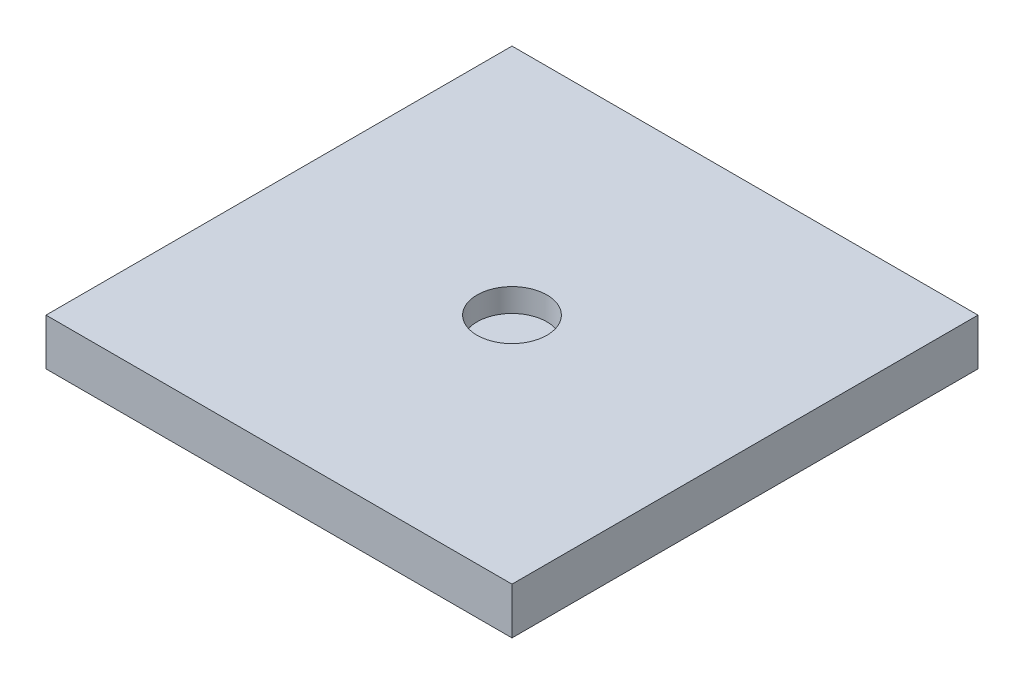
ISO-10303-21;
HEADER;
FILE_DESCRIPTION(('STEP AP214'),'2;1');
FILE_NAME('part.step','',(''),(''),'','','');
FILE_SCHEMA(('AUTOMOTIVE_DESIGN { 1 0 10303 214 1 1 1 1 }'));
ENDSEC;
DATA;
#1=APPLICATION_CONTEXT('core data for automotive mechanical design processes');
#2=APPLICATION_PROTOCOL_DEFINITION('international standard','automotive_design',2000,#1);
#3=PRODUCT_CONTEXT('',#1,'mechanical');
#4=PRODUCT('Part','Part','',(#3));
#5=PRODUCT_RELATED_PRODUCT_CATEGORY('part','',(#4));
#6=PRODUCT_DEFINITION_FORMATION('','',#4);
#7=PRODUCT_DEFINITION_CONTEXT('part definition',#1,'design');
#8=PRODUCT_DEFINITION('design','',#6,#7);
#9=PRODUCT_DEFINITION_SHAPE('','',#8);
#10=(LENGTH_UNIT() NAMED_UNIT(*) SI_UNIT(.MILLI.,.METRE.));
#11=(NAMED_UNIT(*) PLANE_ANGLE_UNIT() SI_UNIT($,.RADIAN.));
#12=(NAMED_UNIT(*) SI_UNIT($,.STERADIAN.) SOLID_ANGLE_UNIT());
#13=UNCERTAINTY_MEASURE_WITH_UNIT(LENGTH_MEASURE(1.E-05),#10,'distance_accuracy_value','');
#14=(GEOMETRIC_REPRESENTATION_CONTEXT(3) GLOBAL_UNCERTAINTY_ASSIGNED_CONTEXT((#13)) GLOBAL_UNIT_ASSIGNED_CONTEXT((#10,
#11,#12)) REPRESENTATION_CONTEXT('',''));
#15=CARTESIAN_POINT('',(0.,0.,0.));
#16=DIRECTION('',(0.,0.,1.));
#17=DIRECTION('',(1.,0.,0.));
#18=AXIS2_PLACEMENT_3D('',#15,#16,#17);
#19=CARTESIAN_POINT('',(20.,4.,-20.));
#20=DIRECTION('',(-1.,0.,0.));
#21=DIRECTION('',(0.,0.,1.));
#22=AXIS2_PLACEMENT_3D('',#19,#20,#21);
#23=PLANE('',#22);
#24=DIRECTION('',(0.,0.,-1.));
#25=VECTOR('',#24,1.);
#26=CARTESIAN_POINT('',(20.,0.,-20.));
#27=LINE('',#26,#25);
#28=CARTESIAN_POINT('',(20.,0.,20.));
#29=VERTEX_POINT('',#28);
#30=CARTESIAN_POINT('',(20.,0.,-20.));
#31=VERTEX_POINT('',#30);
#32=EDGE_CURVE('E111',#29,#31,#27,.T.);
#33=ORIENTED_EDGE('',*,*,#32,.T.);
#34=DIRECTION('',(0.,-1.,0.));
#35=VECTOR('',#34,1.);
#36=CARTESIAN_POINT('',(20.,4.,-20.));
#37=LINE('',#36,#35);
#38=CARTESIAN_POINT('',(20.,4.,-20.));
#39=VERTEX_POINT('',#38);
#40=EDGE_CURVE('E11',#39,#31,#37,.T.);
#41=ORIENTED_EDGE('',*,*,#40,.F.);
#42=DIRECTION('',(0.,0.,-1.));
#43=VECTOR('',#42,1.);
#44=CARTESIAN_POINT('',(20.,4.,-20.));
#45=LINE('',#44,#43);
#46=CARTESIAN_POINT('',(20.,4.,20.));
#47=VERTEX_POINT('',#46);
#48=EDGE_CURVE('E95',#47,#39,#45,.T.);
#49=ORIENTED_EDGE('',*,*,#48,.F.);
#50=DIRECTION('',(0.,-1.,0.));
#51=VECTOR('',#50,1.);
#52=CARTESIAN_POINT('',(20.,4.,20.));
#53=LINE('',#52,#51);
#54=EDGE_CURVE('E107',#47,#29,#53,.T.);
#55=ORIENTED_EDGE('',*,*,#54,.T.);
#56=EDGE_LOOP('',(#33,#41,#49,#55));
#57=FACE_BOUND('',#56,.T.);
#58=ADVANCED_FACE('F43',(#57),#23,.F.);
#59=CARTESIAN_POINT('',(-20.,4.,-20.));
#60=DIRECTION('',(0.,0.,1.));
#61=DIRECTION('',(1.,0.,0.));
#62=AXIS2_PLACEMENT_3D('',#59,#60,#61);
#63=PLANE('',#62);
#64=DIRECTION('',(-1.,0.,0.));
#65=VECTOR('',#64,1.);
#66=CARTESIAN_POINT('',(-20.,0.,-20.));
#67=LINE('',#66,#65);
#68=CARTESIAN_POINT('',(-20.,0.,-20.));
#69=VERTEX_POINT('',#68);
#70=EDGE_CURVE('E100',#31,#69,#67,.T.);
#71=ORIENTED_EDGE('',*,*,#70,.T.);
#72=DIRECTION('',(0.,-1.,0.));
#73=VECTOR('',#72,1.);
#74=CARTESIAN_POINT('',(-20.,4.,-20.));
#75=LINE('',#74,#73);
#76=CARTESIAN_POINT('',(-20.,4.,-20.));
#77=VERTEX_POINT('',#76);
#78=EDGE_CURVE('E52',#77,#69,#75,.T.);
#79=ORIENTED_EDGE('',*,*,#78,.F.);
#80=DIRECTION('',(-1.,0.,0.));
#81=VECTOR('',#80,1.);
#82=CARTESIAN_POINT('',(-20.,4.,-20.));
#83=LINE('',#82,#81);
#84=EDGE_CURVE('E90',#39,#77,#83,.T.);
#85=ORIENTED_EDGE('',*,*,#84,.F.);
#86=ORIENTED_EDGE('',*,*,#40,.T.);
#87=EDGE_LOOP('',(#71,#79,#85,#86));
#88=FACE_BOUND('',#87,.T.);
#89=ADVANCED_FACE('F99',(#88),#63,.F.);
#90=CARTESIAN_POINT('',(-20.,4.,-20.));
#91=DIRECTION('',(1.,0.,0.));
#92=DIRECTION('',(0.,0.,-1.));
#93=AXIS2_PLACEMENT_3D('',#90,#91,#92);
#94=PLANE('',#93);
#95=DIRECTION('',(0.,0.,1.));
#96=VECTOR('',#95,1.);
#97=CARTESIAN_POINT('',(-20.,0.,-20.));
#98=LINE('',#97,#96);
#99=CARTESIAN_POINT('',(-20.,0.,20.));
#100=VERTEX_POINT('',#99);
#101=EDGE_CURVE('E77',#69,#100,#98,.T.);
#102=ORIENTED_EDGE('',*,*,#101,.T.);
#103=DIRECTION('',(0.,-1.,0.));
#104=VECTOR('',#103,1.);
#105=CARTESIAN_POINT('',(-20.,4.,20.));
#106=LINE('',#105,#104);
#107=CARTESIAN_POINT('',(-20.,4.,20.));
#108=VERTEX_POINT('',#107);
#109=EDGE_CURVE('E102',#108,#100,#106,.T.);
#110=ORIENTED_EDGE('',*,*,#109,.F.);
#111=DIRECTION('',(0.,0.,1.));
#112=VECTOR('',#111,1.);
#113=CARTESIAN_POINT('',(-20.,4.,-20.));
#114=LINE('',#113,#112);
#115=EDGE_CURVE('E93',#77,#108,#114,.T.);
#116=ORIENTED_EDGE('',*,*,#115,.F.);
#117=ORIENTED_EDGE('',*,*,#78,.T.);
#118=EDGE_LOOP('',(#102,#110,#116,#117));
#119=FACE_BOUND('',#118,.T.);
#120=ADVANCED_FACE('F103',(#119),#94,.F.);
#121=CARTESIAN_POINT('',(-20.,4.,20.));
#122=DIRECTION('',(0.,0.,-1.));
#123=DIRECTION('',(-1.,0.,0.));
#124=AXIS2_PLACEMENT_3D('',#121,#122,#123);
#125=PLANE('',#124);
#126=DIRECTION('',(1.,0.,0.));
#127=VECTOR('',#126,1.);
#128=CARTESIAN_POINT('',(-20.,0.,20.));
#129=LINE('',#128,#127);
#130=EDGE_CURVE('E83',#100,#29,#129,.T.);
#131=ORIENTED_EDGE('',*,*,#130,.T.);
#132=ORIENTED_EDGE('',*,*,#54,.F.);
#133=DIRECTION('',(1.,0.,0.));
#134=VECTOR('',#133,1.);
#135=CARTESIAN_POINT('',(-20.,4.,20.));
#136=LINE('',#135,#134);
#137=EDGE_CURVE('E60',#108,#47,#136,.T.);
#138=ORIENTED_EDGE('',*,*,#137,.F.);
#139=ORIENTED_EDGE('',*,*,#109,.T.);
#140=EDGE_LOOP('',(#131,#132,#138,#139));
#141=FACE_BOUND('',#140,.T.);
#142=ADVANCED_FACE('F125',(#141),#125,.F.);
#143=CARTESIAN_POINT('',(0.,4.,0.));
#144=DIRECTION('',(0.,1.,0.));
#145=DIRECTION('',(0.,0.,1.));
#146=AXIS2_PLACEMENT_3D('',#143,#144,#145);
#147=PLANE('',#146);
#148=CARTESIAN_POINT('',(0.,4.,0.));
#149=DIRECTION('',(0.,1.,0.));
#150=DIRECTION('',(0.,0.,1.));
#151=AXIS2_PLACEMENT_3D('',#148,#149,#150);
#152=CIRCLE('',#151,3.);
#153=CARTESIAN_POINT('',(0.,4.,3.));
#154=VERTEX_POINT('',#153);
#155=EDGE_CURVE('E132',#154,#154,#152,.T.);
#156=ORIENTED_EDGE('',*,*,#155,.F.);
#157=EDGE_LOOP('',(#156));
#158=FACE_BOUND('',#157,.T.);
#159=ORIENTED_EDGE('',*,*,#48,.T.);
#160=ORIENTED_EDGE('',*,*,#84,.T.);
#161=ORIENTED_EDGE('',*,*,#115,.T.);
#162=ORIENTED_EDGE('',*,*,#137,.T.);
#163=EDGE_LOOP('',(#159,#160,#161,#162));
#164=FACE_BOUND('',#163,.T.);
#165=ADVANCED_FACE('F91',(#158,#164),#147,.T.);
#166=CARTESIAN_POINT('',(0.,0.,0.));
#167=DIRECTION('',(0.,1.,0.));
#168=DIRECTION('',(0.,0.,1.));
#169=AXIS2_PLACEMENT_3D('',#166,#167,#168);
#170=PLANE('',#169);
#171=ORIENTED_EDGE('',*,*,#32,.F.);
#172=ORIENTED_EDGE('',*,*,#130,.F.);
#173=ORIENTED_EDGE('',*,*,#101,.F.);
#174=ORIENTED_EDGE('',*,*,#70,.F.);
#175=EDGE_LOOP('',(#171,#172,#173,#174));
#176=FACE_BOUND('',#175,.T.);
#177=ADVANCED_FACE('F128',(#176),#170,.F.);
#178=CARTESIAN_POINT('',(0.,2.,0.));
#179=DIRECTION('',(0.,1.,0.));
#180=DIRECTION('',(0.,0.,1.));
#181=AXIS2_PLACEMENT_3D('',#178,#179,#180);
#182=CYLINDRICAL_SURFACE('',#181,3.);
#183=CARTESIAN_POINT('',(0.,2.,0.));
#184=DIRECTION('',(0.,1.,0.));
#185=DIRECTION('',(0.,0.,1.));
#186=AXIS2_PLACEMENT_3D('',#183,#184,#185);
#187=CIRCLE('',#186,3.);
#188=CARTESIAN_POINT('',(0.,2.,3.));
#189=VERTEX_POINT('',#188);
#190=EDGE_CURVE('E115',#189,#189,#187,.T.);
#191=ORIENTED_EDGE('',*,*,#190,.F.);
#192=EDGE_LOOP('',(#191));
#193=FACE_BOUND('',#192,.T.);
#194=ORIENTED_EDGE('',*,*,#155,.T.);
#195=EDGE_LOOP('',(#194));
#196=FACE_BOUND('',#195,.T.);
#197=ADVANCED_FACE('F142',(#193,#196),#182,.F.);
#198=CARTESIAN_POINT('',(0.,2.,0.));
#199=DIRECTION('',(0.,1.,0.));
#200=DIRECTION('',(0.,0.,1.));
#201=AXIS2_PLACEMENT_3D('',#198,#199,#200);
#202=PLANE('',#201);
#203=ORIENTED_EDGE('',*,*,#190,.T.);
#204=EDGE_LOOP('',(#203));
#205=FACE_BOUND('',#204,.T.);
#206=ADVANCED_FACE('F140',(#205),#202,.T.);
#207=CLOSED_SHELL('',(#58,#89,#120,#142,#165,#177,#197,#206));
#208=MANIFOLD_SOLID_BREP('B2',#207);
#209=ADVANCED_BREP_SHAPE_REPRESENTATION('',(#18,#208),#14);
#210=SHAPE_DEFINITION_REPRESENTATION(#9,#209);
ENDSEC;
END-ISO-10303-21;
